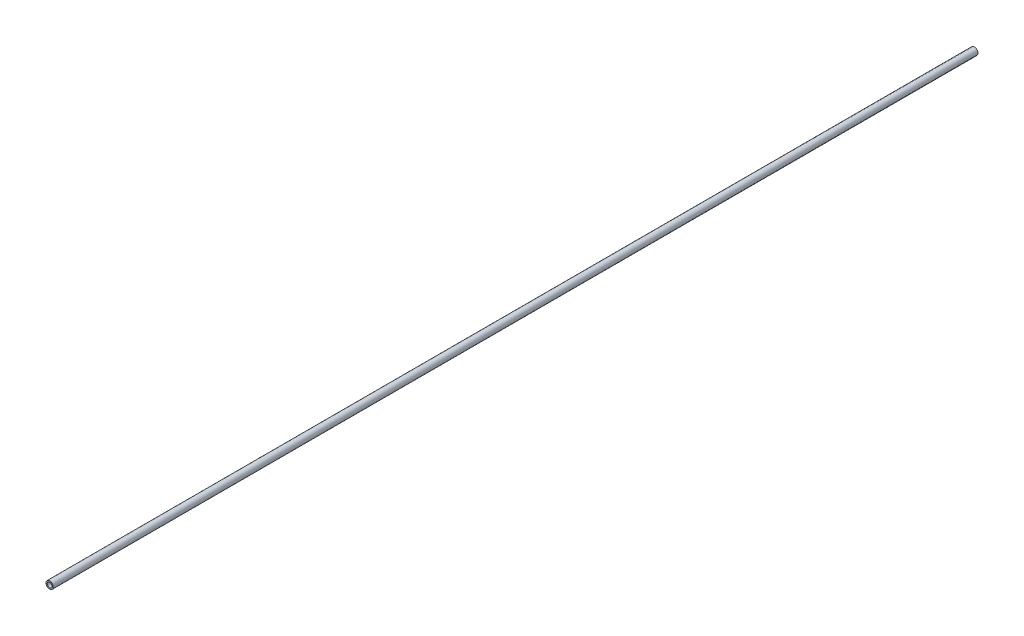
ISO-10303-21;
HEADER;
FILE_DESCRIPTION(('STEP AP214'),'2;1');
FILE_NAME('part.step','',(''),(''),'','','');
FILE_SCHEMA(('AUTOMOTIVE_DESIGN { 1 0 10303 214 1 1 1 1 }'));
ENDSEC;
DATA;
#1=APPLICATION_CONTEXT('core data for automotive mechanical design processes');
#2=APPLICATION_PROTOCOL_DEFINITION('international standard','automotive_design',2000,#1);
#3=PRODUCT_CONTEXT('',#1,'mechanical');
#4=PRODUCT('Part','Part','',(#3));
#5=PRODUCT_RELATED_PRODUCT_CATEGORY('part','',(#4));
#6=PRODUCT_DEFINITION_FORMATION('','',#4);
#7=PRODUCT_DEFINITION_CONTEXT('part definition',#1,'design');
#8=PRODUCT_DEFINITION('design','',#6,#7);
#9=PRODUCT_DEFINITION_SHAPE('','',#8);
#10=(LENGTH_UNIT() NAMED_UNIT(*) SI_UNIT(.MILLI.,.METRE.));
#11=(NAMED_UNIT(*) PLANE_ANGLE_UNIT() SI_UNIT($,.RADIAN.));
#12=(NAMED_UNIT(*) SI_UNIT($,.STERADIAN.) SOLID_ANGLE_UNIT());
#13=UNCERTAINTY_MEASURE_WITH_UNIT(LENGTH_MEASURE(1.E-05),#10,'distance_accuracy_value','');
#14=(GEOMETRIC_REPRESENTATION_CONTEXT(3) GLOBAL_UNCERTAINTY_ASSIGNED_CONTEXT((#13)) GLOBAL_UNIT_ASSIGNED_CONTEXT((#10,
#11,#12)) REPRESENTATION_CONTEXT('',''));
#15=CARTESIAN_POINT('',(0.,0.,0.));
#16=DIRECTION('',(0.,0.,1.));
#17=DIRECTION('',(1.,0.,0.));
#18=AXIS2_PLACEMENT_3D('',#15,#16,#17);
#19=CARTESIAN_POINT('',(0.,0.,1219.2));
#20=DIRECTION('',(0.,0.,1.));
#21=DIRECTION('',(1.,0.,0.));
#22=AXIS2_PLACEMENT_3D('',#19,#20,#21);
#23=PLANE('',#22);
#24=CARTESIAN_POINT('',(0.,0.,1219.2));
#25=DIRECTION('',(0.,0.,1.));
#26=DIRECTION('',(1.,0.,0.));
#27=AXIS2_PLACEMENT_3D('',#24,#25,#26);
#28=CIRCLE('',#27,4.7625);
#29=CARTESIAN_POINT('',(-4.7625,0.,1219.2));
#30=VERTEX_POINT('',#29);
#31=EDGE_CURVE('E10',#30,#30,#28,.T.);
#32=ORIENTED_EDGE('',*,*,#31,.T.);
#33=EDGE_LOOP('',(#32));
#34=FACE_BOUND('',#33,.T.);
#35=CARTESIAN_POINT('',(0.,0.,1219.2));
#36=DIRECTION('',(0.,0.,1.));
#37=DIRECTION('',(1.,0.,0.));
#38=AXIS2_PLACEMENT_3D('',#35,#36,#37);
#39=CIRCLE('',#38,3.175);
#40=CARTESIAN_POINT('',(-3.175,0.,1219.2));
#41=VERTEX_POINT('',#40);
#42=EDGE_CURVE('E49',#41,#41,#39,.T.);
#43=ORIENTED_EDGE('',*,*,#42,.F.);
#44=EDGE_LOOP('',(#43));
#45=FACE_BOUND('',#44,.T.);
#46=ADVANCED_FACE('F38',(#34,#45),#23,.T.);
#47=CARTESIAN_POINT('',(0.,0.,0.));
#48=DIRECTION('',(0.,0.,1.));
#49=DIRECTION('',(1.,0.,0.));
#50=AXIS2_PLACEMENT_3D('',#47,#48,#49);
#51=PLANE('',#50);
#52=CARTESIAN_POINT('',(0.,0.,0.));
#53=DIRECTION('',(0.,0.,1.));
#54=DIRECTION('',(1.,0.,0.));
#55=AXIS2_PLACEMENT_3D('',#52,#53,#54);
#56=CIRCLE('',#55,4.7625);
#57=CARTESIAN_POINT('',(-4.7625,0.,0.));
#58=VERTEX_POINT('',#57);
#59=EDGE_CURVE('E42',#58,#58,#56,.T.);
#60=ORIENTED_EDGE('',*,*,#59,.F.);
#61=EDGE_LOOP('',(#60));
#62=FACE_BOUND('',#61,.T.);
#63=CARTESIAN_POINT('',(0.,0.,0.));
#64=DIRECTION('',(0.,0.,1.));
#65=DIRECTION('',(1.,0.,0.));
#66=AXIS2_PLACEMENT_3D('',#63,#64,#65);
#67=CIRCLE('',#66,3.175);
#68=CARTESIAN_POINT('',(-3.175,0.,0.));
#69=VERTEX_POINT('',#68);
#70=EDGE_CURVE('E51',#69,#69,#67,.T.);
#71=ORIENTED_EDGE('',*,*,#70,.T.);
#72=EDGE_LOOP('',(#71));
#73=FACE_BOUND('',#72,.T.);
#74=ADVANCED_FACE('F61',(#62,#73),#51,.F.);
#75=CARTESIAN_POINT('',(0.,0.,1219.2));
#76=DIRECTION('',(0.,0.,-1.));
#77=DIRECTION('',(-1.,0.,0.));
#78=AXIS2_PLACEMENT_3D('',#75,#76,#77);
#79=CYLINDRICAL_SURFACE('',#78,4.7625);
#80=CARTESIAN_POINT('',(-4.7625,0.,1219.2));
#81=CARTESIAN_POINT('',(-4.7625,0.,1206.5));
#82=CARTESIAN_POINT('',(-4.7625,0.,1193.8));
#83=CARTESIAN_POINT('',(-4.7625,0.,1168.4));
#84=CARTESIAN_POINT('',(-4.7625,0.,1155.7));
#85=CARTESIAN_POINT('',(-4.7625,0.,1130.3));
#86=CARTESIAN_POINT('',(-4.7625,0.,1117.6));
#87=CARTESIAN_POINT('',(-4.7625,0.,1092.2));
#88=CARTESIAN_POINT('',(-4.7625,0.,1079.5));
#89=CARTESIAN_POINT('',(-4.7625,0.,1054.1));
#90=CARTESIAN_POINT('',(-4.7625,0.,1041.4));
#91=CARTESIAN_POINT('',(-4.7625,0.,1016.));
#92=CARTESIAN_POINT('',(-4.7625,0.,1003.3));
#93=CARTESIAN_POINT('',(-4.7625,0.,977.9));
#94=CARTESIAN_POINT('',(-4.7625,0.,965.2));
#95=CARTESIAN_POINT('',(-4.7625,0.,939.8));
#96=CARTESIAN_POINT('',(-4.7625,0.,927.1));
#97=CARTESIAN_POINT('',(-4.7625,0.,901.7));
#98=CARTESIAN_POINT('',(-4.7625,0.,889.));
#99=CARTESIAN_POINT('',(-4.7625,0.,863.6));
#100=CARTESIAN_POINT('',(-4.7625,0.,850.9));
#101=CARTESIAN_POINT('',(-4.7625,0.,825.5));
#102=CARTESIAN_POINT('',(-4.7625,0.,812.8));
#103=CARTESIAN_POINT('',(-4.7625,0.,787.4));
#104=CARTESIAN_POINT('',(-4.7625,0.,774.7));
#105=CARTESIAN_POINT('',(-4.7625,0.,749.3));
#106=CARTESIAN_POINT('',(-4.7625,0.,736.6));
#107=CARTESIAN_POINT('',(-4.7625,0.,711.2));
#108=CARTESIAN_POINT('',(-4.7625,0.,698.5));
#109=CARTESIAN_POINT('',(-4.7625,0.,673.1));
#110=CARTESIAN_POINT('',(-4.7625,0.,660.4));
#111=CARTESIAN_POINT('',(-4.7625,0.,635.));
#112=CARTESIAN_POINT('',(-4.7625,0.,622.3));
#113=CARTESIAN_POINT('',(-4.7625,0.,596.9));
#114=CARTESIAN_POINT('',(-4.7625,0.,584.2));
#115=CARTESIAN_POINT('',(-4.7625,0.,558.8));
#116=CARTESIAN_POINT('',(-4.7625,0.,546.1));
#117=CARTESIAN_POINT('',(-4.7625,0.,520.7));
#118=CARTESIAN_POINT('',(-4.7625,0.,508.));
#119=CARTESIAN_POINT('',(-4.7625,0.,482.6));
#120=CARTESIAN_POINT('',(-4.7625,0.,469.9));
#121=CARTESIAN_POINT('',(-4.7625,0.,444.5));
#122=CARTESIAN_POINT('',(-4.7625,0.,431.8));
#123=CARTESIAN_POINT('',(-4.7625,0.,406.4));
#124=CARTESIAN_POINT('',(-4.7625,0.,393.7));
#125=CARTESIAN_POINT('',(-4.7625,0.,368.3));
#126=CARTESIAN_POINT('',(-4.7625,0.,355.6));
#127=CARTESIAN_POINT('',(-4.7625,0.,330.2));
#128=CARTESIAN_POINT('',(-4.7625,0.,317.5));
#129=CARTESIAN_POINT('',(-4.7625,0.,292.1));
#130=CARTESIAN_POINT('',(-4.7625,0.,279.4));
#131=CARTESIAN_POINT('',(-4.7625,0.,254.));
#132=CARTESIAN_POINT('',(-4.7625,0.,241.3));
#133=CARTESIAN_POINT('',(-4.7625,0.,215.9));
#134=CARTESIAN_POINT('',(-4.7625,0.,203.2));
#135=CARTESIAN_POINT('',(-4.7625,0.,177.8));
#136=CARTESIAN_POINT('',(-4.7625,0.,165.1));
#137=CARTESIAN_POINT('',(-4.7625,0.,139.7));
#138=CARTESIAN_POINT('',(-4.7625,0.,127.));
#139=CARTESIAN_POINT('',(-4.7625,0.,101.6));
#140=CARTESIAN_POINT('',(-4.7625,0.,88.9));
#141=CARTESIAN_POINT('',(-4.7625,0.,63.5));
#142=CARTESIAN_POINT('',(-4.7625,0.,50.8));
#143=CARTESIAN_POINT('',(-4.7625,0.,25.4));
#144=CARTESIAN_POINT('',(-4.7625,0.,12.7));
#145=CARTESIAN_POINT('',(-4.7625,0.,0.));
#146=B_SPLINE_CURVE_WITH_KNOTS('',3,(#80,#81,#82,#83,#84,#85,#86,#87,#88,#89,#90,#91,#92,#93,
#94,#95,#96,#97,#98,#99,#100,#101,#102,#103,#104,#105,#106,#107,#108,#109,#110,#111,#112,#113,
#114,#115,#116,#117,#118,#119,#120,#121,#122,#123,#124,#125,#126,#127,#128,#129,#130,#131,#132,
#133,#134,#135,#136,#137,#138,#139,#140,#141,#142,#143,#144,#145),.UNSPECIFIED.,.F.,.F.,(4,2,2,
2,2,2,2,2,2,2,2,2,2,2,2,2,2,2,2,2,2,2,2,2,2,2,2,2,2,2,2,2,4),(0.,38.1,76.2,114.3,152.4,190.5,
228.6,266.7,304.8,342.9,381.,419.1,457.2,495.3,533.4,571.5,609.6,647.7,685.8,723.9,762.,800.1,
838.2,876.3,914.4,952.5,990.6,1028.7,1066.8,1104.9,1143.,1181.1,1219.2),.UNSPECIFIED.);
#147=EDGE_CURVE('BSEAM40',#30,#58,#146,.T.);
#148=ORIENTED_EDGE('',*,*,#31,.F.);
#149=ORIENTED_EDGE('',*,*,#59,.T.);
#150=ORIENTED_EDGE('',*,*,#147,.T.);
#151=ORIENTED_EDGE('',*,*,#147,.F.);
#152=EDGE_LOOP('',(#148,#150,#149,#151));
#153=FACE_BOUND('',#152,.T.);
#154=ADVANCED_FACE('F40',(#153),#79,.T.);
#155=CARTESIAN_POINT('',(0.,0.,1219.2));
#156=DIRECTION('',(0.,0.,-1.));
#157=DIRECTION('',(-1.,0.,0.));
#158=AXIS2_PLACEMENT_3D('',#155,#156,#157);
#159=CYLINDRICAL_SURFACE('',#158,3.175);
#160=CARTESIAN_POINT('',(-3.175,0.,1219.2));
#161=CARTESIAN_POINT('',(-3.175,0.,1206.5));
#162=CARTESIAN_POINT('',(-3.175,0.,1193.8));
#163=CARTESIAN_POINT('',(-3.175,0.,1168.4));
#164=CARTESIAN_POINT('',(-3.175,0.,1155.7));
#165=CARTESIAN_POINT('',(-3.175,0.,1130.3));
#166=CARTESIAN_POINT('',(-3.175,0.,1117.6));
#167=CARTESIAN_POINT('',(-3.175,0.,1092.2));
#168=CARTESIAN_POINT('',(-3.175,0.,1079.5));
#169=CARTESIAN_POINT('',(-3.175,0.,1054.1));
#170=CARTESIAN_POINT('',(-3.175,0.,1041.4));
#171=CARTESIAN_POINT('',(-3.175,0.,1016.));
#172=CARTESIAN_POINT('',(-3.175,0.,1003.3));
#173=CARTESIAN_POINT('',(-3.175,0.,977.9));
#174=CARTESIAN_POINT('',(-3.175,0.,965.2));
#175=CARTESIAN_POINT('',(-3.175,0.,939.8));
#176=CARTESIAN_POINT('',(-3.175,0.,927.1));
#177=CARTESIAN_POINT('',(-3.175,0.,901.7));
#178=CARTESIAN_POINT('',(-3.175,0.,889.));
#179=CARTESIAN_POINT('',(-3.175,0.,863.6));
#180=CARTESIAN_POINT('',(-3.175,0.,850.9));
#181=CARTESIAN_POINT('',(-3.175,0.,825.5));
#182=CARTESIAN_POINT('',(-3.175,0.,812.8));
#183=CARTESIAN_POINT('',(-3.175,0.,787.4));
#184=CARTESIAN_POINT('',(-3.175,0.,774.7));
#185=CARTESIAN_POINT('',(-3.175,0.,749.3));
#186=CARTESIAN_POINT('',(-3.175,0.,736.6));
#187=CARTESIAN_POINT('',(-3.175,0.,711.2));
#188=CARTESIAN_POINT('',(-3.175,0.,698.5));
#189=CARTESIAN_POINT('',(-3.175,0.,673.1));
#190=CARTESIAN_POINT('',(-3.175,0.,660.4));
#191=CARTESIAN_POINT('',(-3.175,0.,635.));
#192=CARTESIAN_POINT('',(-3.175,0.,622.3));
#193=CARTESIAN_POINT('',(-3.175,0.,596.9));
#194=CARTESIAN_POINT('',(-3.175,0.,584.2));
#195=CARTESIAN_POINT('',(-3.175,0.,558.8));
#196=CARTESIAN_POINT('',(-3.175,0.,546.1));
#197=CARTESIAN_POINT('',(-3.175,0.,520.7));
#198=CARTESIAN_POINT('',(-3.175,0.,508.));
#199=CARTESIAN_POINT('',(-3.175,0.,482.6));
#200=CARTESIAN_POINT('',(-3.175,0.,469.9));
#201=CARTESIAN_POINT('',(-3.175,0.,444.5));
#202=CARTESIAN_POINT('',(-3.175,0.,431.8));
#203=CARTESIAN_POINT('',(-3.175,0.,406.4));
#204=CARTESIAN_POINT('',(-3.175,0.,393.7));
#205=CARTESIAN_POINT('',(-3.175,0.,368.3));
#206=CARTESIAN_POINT('',(-3.175,0.,355.6));
#207=CARTESIAN_POINT('',(-3.175,0.,330.2));
#208=CARTESIAN_POINT('',(-3.175,0.,317.5));
#209=CARTESIAN_POINT('',(-3.175,0.,292.1));
#210=CARTESIAN_POINT('',(-3.175,0.,279.4));
#211=CARTESIAN_POINT('',(-3.175,0.,254.));
#212=CARTESIAN_POINT('',(-3.175,0.,241.3));
#213=CARTESIAN_POINT('',(-3.175,0.,215.9));
#214=CARTESIAN_POINT('',(-3.175,0.,203.2));
#215=CARTESIAN_POINT('',(-3.175,0.,177.8));
#216=CARTESIAN_POINT('',(-3.175,0.,165.1));
#217=CARTESIAN_POINT('',(-3.175,0.,139.7));
#218=CARTESIAN_POINT('',(-3.175,0.,127.));
#219=CARTESIAN_POINT('',(-3.175,0.,101.6));
#220=CARTESIAN_POINT('',(-3.175,0.,88.9));
#221=CARTESIAN_POINT('',(-3.175,0.,63.5));
#222=CARTESIAN_POINT('',(-3.175,0.,50.8));
#223=CARTESIAN_POINT('',(-3.175,0.,25.4));
#224=CARTESIAN_POINT('',(-3.175,0.,12.7));
#225=CARTESIAN_POINT('',(-3.175,0.,0.));
#226=B_SPLINE_CURVE_WITH_KNOTS('',3,(#160,#161,#162,#163,#164,#165,#166,#167,#168,#169,#170,
#171,#172,#173,#174,#175,#176,#177,#178,#179,#180,#181,#182,#183,#184,#185,#186,#187,#188,#189,
#190,#191,#192,#193,#194,#195,#196,#197,#198,#199,#200,#201,#202,#203,#204,#205,#206,#207,#208,
#209,#210,#211,#212,#213,#214,#215,#216,#217,#218,#219,#220,#221,#222,#223,#224,#225),
.UNSPECIFIED.,.F.,.F.,(4,2,2,2,2,2,2,2,2,2,2,2,2,2,2,2,2,2,2,2,2,2,2,2,2,2,2,2,2,2,2,2,4),(0.,
38.1,76.2,114.3,152.4,190.5,228.6,266.7,304.8,342.9,381.,419.1,457.2,495.3,533.4,571.5,609.6,
647.7,685.8,723.9,762.,800.1,838.2,876.3,914.4,952.5,990.6,1028.7,1066.8,1104.9,1143.,1181.1,
1219.2),.UNSPECIFIED.);
#227=EDGE_CURVE('BSEAM57',#41,#69,#226,.T.);
#228=ORIENTED_EDGE('',*,*,#42,.T.);
#229=ORIENTED_EDGE('',*,*,#70,.F.);
#230=ORIENTED_EDGE('',*,*,#227,.T.);
#231=ORIENTED_EDGE('',*,*,#227,.F.);
#232=EDGE_LOOP('',(#228,#230,#229,#231));
#233=FACE_BOUND('',#232,.T.);
#234=ADVANCED_FACE('F57',(#233),#159,.F.);
#235=CLOSED_SHELL('',(#46,#74,#154,#234));
#236=MANIFOLD_SOLID_BREP('B2',#235);
#237=ADVANCED_BREP_SHAPE_REPRESENTATION('',(#18,#236),#14);
#238=SHAPE_DEFINITION_REPRESENTATION(#9,#237);
ENDSEC;
END-ISO-10303-21;
